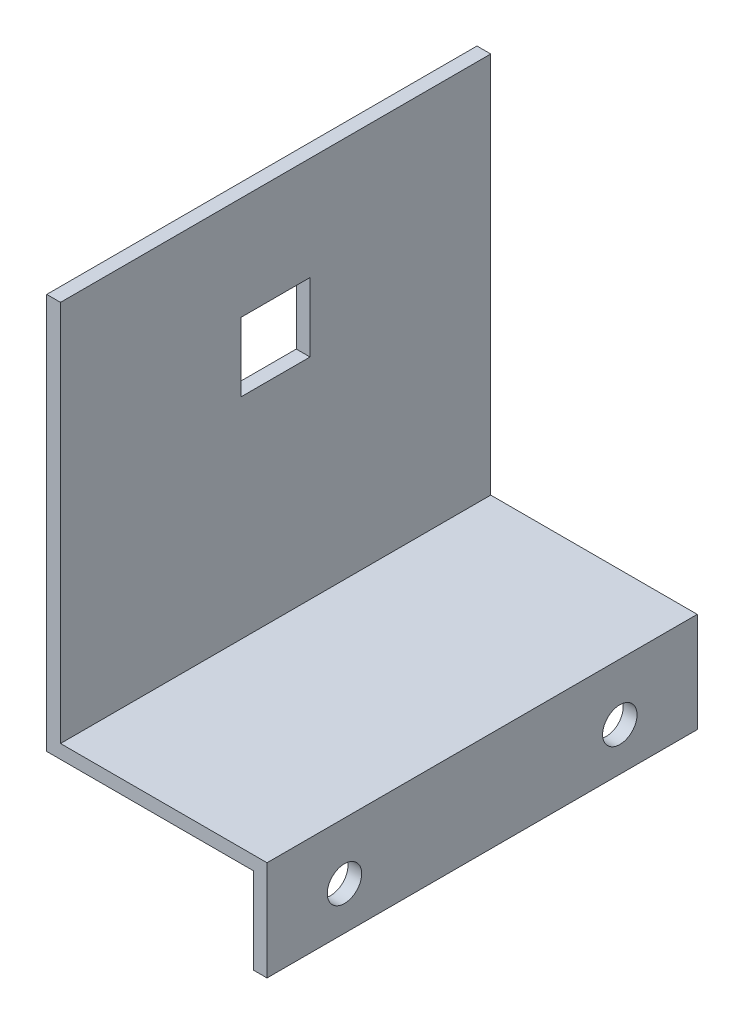
ISO-10303-21;
HEADER;
FILE_DESCRIPTION(('STEP AP214'),'2;1');
FILE_NAME('part.step','',(''),(''),'','','');
FILE_SCHEMA(('AUTOMOTIVE_DESIGN { 1 0 10303 214 1 1 1 1 }'));
ENDSEC;
DATA;
#1=APPLICATION_CONTEXT('core data for automotive mechanical design processes');
#2=APPLICATION_PROTOCOL_DEFINITION('international standard','automotive_design',2000,#1);
#3=PRODUCT_CONTEXT('',#1,'mechanical');
#4=PRODUCT('Part','Part','',(#3));
#5=PRODUCT_RELATED_PRODUCT_CATEGORY('part','',(#4));
#6=PRODUCT_DEFINITION_FORMATION('','',#4);
#7=PRODUCT_DEFINITION_CONTEXT('part definition',#1,'design');
#8=PRODUCT_DEFINITION('design','',#6,#7);
#9=PRODUCT_DEFINITION_SHAPE('','',#8);
#10=(LENGTH_UNIT() NAMED_UNIT(*) SI_UNIT(.MILLI.,.METRE.));
#11=(NAMED_UNIT(*) PLANE_ANGLE_UNIT() SI_UNIT($,.RADIAN.));
#12=(NAMED_UNIT(*) SI_UNIT($,.STERADIAN.) SOLID_ANGLE_UNIT());
#13=UNCERTAINTY_MEASURE_WITH_UNIT(LENGTH_MEASURE(1.E-05),#10,'distance_accuracy_value','');
#14=(GEOMETRIC_REPRESENTATION_CONTEXT(3) GLOBAL_UNCERTAINTY_ASSIGNED_CONTEXT((#13)) GLOBAL_UNIT_ASSIGNED_CONTEXT((#10,
#11,#12)) REPRESENTATION_CONTEXT('',''));
#15=CARTESIAN_POINT('',(0.,0.,0.));
#16=DIRECTION('',(0.,0.,1.));
#17=DIRECTION('',(1.,0.,0.));
#18=AXIS2_PLACEMENT_3D('',#15,#16,#17);
#19=CARTESIAN_POINT('',(0.,0.,-63.5));
#20=DIRECTION('',(-1.,0.,0.));
#21=DIRECTION('',(0.,0.,1.));
#22=AXIS2_PLACEMENT_3D('',#19,#20,#21);
#23=PLANE('',#22);
#24=DIRECTION('',(0.,1.,0.));
#25=VECTOR('',#24,1.);
#26=CARTESIAN_POINT('',(0.,43.18,-36.83));
#27=LINE('',#26,#25);
#28=CARTESIAN_POINT('',(0.,33.02,-36.83));
#29=VERTEX_POINT('',#28);
#30=CARTESIAN_POINT('',(0.,43.18,-36.83));
#31=VERTEX_POINT('',#30);
#32=EDGE_CURVE('E124',#29,#31,#27,.T.);
#33=ORIENTED_EDGE('',*,*,#32,.T.);
#34=DIRECTION('',(0.,0.,1.));
#35=VECTOR('',#34,1.);
#36=CARTESIAN_POINT('',(0.,43.18,-31.75));
#37=LINE('',#36,#35);
#38=CARTESIAN_POINT('',(0.,43.18,-26.67));
#39=VERTEX_POINT('',#38);
#40=EDGE_CURVE('E133',#31,#39,#37,.T.);
#41=ORIENTED_EDGE('',*,*,#40,.T.);
#42=DIRECTION('',(0.,-1.,0.));
#43=VECTOR('',#42,1.);
#44=CARTESIAN_POINT('',(0.,33.02,-26.67));
#45=LINE('',#44,#43);
#46=CARTESIAN_POINT('',(0.,33.02,-26.67));
#47=VERTEX_POINT('',#46);
#48=EDGE_CURVE('E49',#39,#47,#45,.T.);
#49=ORIENTED_EDGE('',*,*,#48,.T.);
#50=DIRECTION('',(0.,0.,-1.));
#51=VECTOR('',#50,1.);
#52=CARTESIAN_POINT('',(0.,33.02,-36.83));
#53=LINE('',#52,#51);
#54=EDGE_CURVE('E130',#47,#29,#53,.T.);
#55=ORIENTED_EDGE('',*,*,#54,.T.);
#56=EDGE_LOOP('',(#33,#41,#49,#55));
#57=FACE_BOUND('',#56,.T.);
#58=DIRECTION('',(0.,-1.,0.));
#59=VECTOR('',#58,1.);
#60=CARTESIAN_POINT('',(0.,0.,0.));
#61=LINE('',#60,#59);
#62=CARTESIAN_POINT('',(0.,58.42,0.));
#63=VERTEX_POINT('',#62);
#64=CARTESIAN_POINT('',(0.,0.,0.));
#65=VERTEX_POINT('',#64);
#66=EDGE_CURVE('E158',#63,#65,#61,.T.);
#67=ORIENTED_EDGE('',*,*,#66,.F.);
#68=DIRECTION('',(0.,0.,1.));
#69=VECTOR('',#68,1.);
#70=CARTESIAN_POINT('',(0.,58.42,-63.5));
#71=LINE('',#70,#69);
#72=CARTESIAN_POINT('',(0.,58.42,-63.5));
#73=VERTEX_POINT('',#72);
#74=EDGE_CURVE('E11',#73,#63,#71,.T.);
#75=ORIENTED_EDGE('',*,*,#74,.F.);
#76=DIRECTION('',(0.,-1.,0.));
#77=VECTOR('',#76,1.);
#78=CARTESIAN_POINT('',(0.,0.,-63.5));
#79=LINE('',#78,#77);
#80=CARTESIAN_POINT('',(0.,0.,-63.5));
#81=VERTEX_POINT('',#80);
#82=EDGE_CURVE('E162',#73,#81,#79,.T.);
#83=ORIENTED_EDGE('',*,*,#82,.T.);
#84=DIRECTION('',(0.,0.,1.));
#85=VECTOR('',#84,1.);
#86=CARTESIAN_POINT('',(0.,0.,-63.5));
#87=LINE('',#86,#85);
#88=EDGE_CURVE('E36',#81,#65,#87,.T.);
#89=ORIENTED_EDGE('',*,*,#88,.T.);
#90=EDGE_LOOP('',(#67,#75,#83,#89));
#91=FACE_BOUND('',#90,.T.);
#92=ADVANCED_FACE('F33',(#57,#91),#23,.T.);
#93=CARTESIAN_POINT('',(0.,58.42,-63.5));
#94=DIRECTION('',(0.,1.,0.));
#95=DIRECTION('',(0.,0.,1.));
#96=AXIS2_PLACEMENT_3D('',#93,#94,#95);
#97=PLANE('',#96);
#98=DIRECTION('',(-1.,0.,0.));
#99=VECTOR('',#98,1.);
#100=CARTESIAN_POINT('',(0.,58.42,0.));
#101=LINE('',#100,#99);
#102=CARTESIAN_POINT('',(2.03199999999999,58.42,0.));
#103=VERTEX_POINT('',#102);
#104=EDGE_CURVE('E166',#103,#63,#101,.T.);
#105=ORIENTED_EDGE('',*,*,#104,.F.);
#106=DIRECTION('',(0.,0.,1.));
#107=VECTOR('',#106,1.);
#108=CARTESIAN_POINT('',(2.03199999999999,58.42,-63.5));
#109=LINE('',#108,#107);
#110=CARTESIAN_POINT('',(2.03199999999999,58.42,-63.5));
#111=VERTEX_POINT('',#110);
#112=EDGE_CURVE('E41',#111,#103,#109,.T.);
#113=ORIENTED_EDGE('',*,*,#112,.F.);
#114=DIRECTION('',(-1.,0.,0.));
#115=VECTOR('',#114,1.);
#116=CARTESIAN_POINT('',(0.,58.42,-63.5));
#117=LINE('',#116,#115);
#118=EDGE_CURVE('E184',#111,#73,#117,.T.);
#119=ORIENTED_EDGE('',*,*,#118,.T.);
#120=ORIENTED_EDGE('',*,*,#74,.T.);
#121=EDGE_LOOP('',(#105,#113,#119,#120));
#122=FACE_BOUND('',#121,.T.);
#123=ADVANCED_FACE('F230',(#122),#97,.T.);
#124=CARTESIAN_POINT('',(2.03199999999999,58.42,-63.5));
#125=DIRECTION('',(1.,0.,0.));
#126=DIRECTION('',(0.,1.,0.));
#127=AXIS2_PLACEMENT_3D('',#124,#125,#126);
#128=PLANE('',#127);
#129=DIRECTION('',(0.,1.,0.));
#130=VECTOR('',#129,1.);
#131=CARTESIAN_POINT('',(2.032,43.18,-36.83));
#132=LINE('',#131,#130);
#133=CARTESIAN_POINT('',(2.032,33.02,-36.83));
#134=VERTEX_POINT('',#133);
#135=CARTESIAN_POINT('',(2.03199999999999,43.18,-36.83));
#136=VERTEX_POINT('',#135);
#137=EDGE_CURVE('E57',#134,#136,#132,.T.);
#138=ORIENTED_EDGE('',*,*,#137,.F.);
#139=DIRECTION('',(0.,0.,-1.));
#140=VECTOR('',#139,1.);
#141=CARTESIAN_POINT('',(2.032,33.02,-36.83));
#142=LINE('',#141,#140);
#143=CARTESIAN_POINT('',(2.032,33.02,-26.67));
#144=VERTEX_POINT('',#143);
#145=EDGE_CURVE('E139',#144,#134,#142,.T.);
#146=ORIENTED_EDGE('',*,*,#145,.F.);
#147=DIRECTION('',(0.,-1.,0.));
#148=VECTOR('',#147,1.);
#149=CARTESIAN_POINT('',(2.032,33.02,-26.67));
#150=LINE('',#149,#148);
#151=CARTESIAN_POINT('',(2.032,43.18,-26.67));
#152=VERTEX_POINT('',#151);
#153=EDGE_CURVE('E142',#152,#144,#150,.T.);
#154=ORIENTED_EDGE('',*,*,#153,.F.);
#155=DIRECTION('',(0.,0.,1.));
#156=VECTOR('',#155,1.);
#157=CARTESIAN_POINT('',(2.032,43.18,-26.67));
#158=LINE('',#157,#156);
#159=EDGE_CURVE('E151',#136,#152,#158,.T.);
#160=ORIENTED_EDGE('',*,*,#159,.F.);
#161=EDGE_LOOP('',(#138,#146,#154,#160));
#162=FACE_BOUND('',#161,.T.);
#163=DIRECTION('',(0.,1.,0.));
#164=VECTOR('',#163,1.);
#165=CARTESIAN_POINT('',(2.03199999999999,58.42,0.));
#166=LINE('',#165,#164);
#167=CARTESIAN_POINT('',(2.032,2.032,0.));
#168=VERTEX_POINT('',#167);
#169=EDGE_CURVE('E204',#168,#103,#166,.T.);
#170=ORIENTED_EDGE('',*,*,#169,.F.);
#171=DIRECTION('',(0.,0.,1.));
#172=VECTOR('',#171,1.);
#173=CARTESIAN_POINT('',(2.032,2.032,-63.5));
#174=LINE('',#173,#172);
#175=CARTESIAN_POINT('',(2.032,2.032,-63.5));
#176=VERTEX_POINT('',#175);
#177=EDGE_CURVE('E210',#176,#168,#174,.T.);
#178=ORIENTED_EDGE('',*,*,#177,.F.);
#179=DIRECTION('',(0.,1.,0.));
#180=VECTOR('',#179,1.);
#181=CARTESIAN_POINT('',(2.03199999999999,58.42,-63.5));
#182=LINE('',#181,#180);
#183=EDGE_CURVE('E181',#176,#111,#182,.T.);
#184=ORIENTED_EDGE('',*,*,#183,.T.);
#185=ORIENTED_EDGE('',*,*,#112,.T.);
#186=EDGE_LOOP('',(#170,#178,#184,#185));
#187=FACE_BOUND('',#186,.T.);
#188=ADVANCED_FACE('F251',(#162,#187),#128,.T.);
#189=CARTESIAN_POINT('',(2.032,2.032,-63.5));
#190=DIRECTION('',(0.,1.,0.));
#191=DIRECTION('',(0.,0.,1.));
#192=AXIS2_PLACEMENT_3D('',#189,#190,#191);
#193=PLANE('',#192);
#194=DIRECTION('',(-1.,0.,0.));
#195=VECTOR('',#194,1.);
#196=CARTESIAN_POINT('',(2.032,2.032,0.));
#197=LINE('',#196,#195);
#198=CARTESIAN_POINT('',(32.512,2.032,0.));
#199=VERTEX_POINT('',#198);
#200=EDGE_CURVE('E201',#199,#168,#197,.T.);
#201=ORIENTED_EDGE('',*,*,#200,.F.);
#202=DIRECTION('',(0.,0.,1.));
#203=VECTOR('',#202,1.);
#204=CARTESIAN_POINT('',(32.512,2.032,-63.5));
#205=LINE('',#204,#203);
#206=CARTESIAN_POINT('',(32.512,2.032,-63.5));
#207=VERTEX_POINT('',#206);
#208=EDGE_CURVE('E212',#207,#199,#205,.T.);
#209=ORIENTED_EDGE('',*,*,#208,.F.);
#210=DIRECTION('',(-1.,0.,0.));
#211=VECTOR('',#210,1.);
#212=CARTESIAN_POINT('',(2.032,2.032,-63.5));
#213=LINE('',#212,#211);
#214=EDGE_CURVE('E178',#207,#176,#213,.T.);
#215=ORIENTED_EDGE('',*,*,#214,.T.);
#216=ORIENTED_EDGE('',*,*,#177,.T.);
#217=EDGE_LOOP('',(#201,#209,#215,#216));
#218=FACE_BOUND('',#217,.T.);
#219=ADVANCED_FACE('F249',(#218),#193,.T.);
#220=CARTESIAN_POINT('',(32.512,2.032,-63.5));
#221=DIRECTION('',(1.,0.,0.));
#222=DIRECTION('',(0.,0.,-1.));
#223=AXIS2_PLACEMENT_3D('',#220,#221,#222);
#224=PLANE('',#223);
#225=CARTESIAN_POINT('',(32.512,-6.35,-11.43));
#226=DIRECTION('',(-1.,0.,0.));
#227=DIRECTION('',(0.,0.,-1.));
#228=AXIS2_PLACEMENT_3D('',#225,#226,#227);
#229=CIRCLE('',#228,2.54);
#230=CARTESIAN_POINT('',(32.512,-6.35,-13.97));
#231=VERTEX_POINT('',#230);
#232=EDGE_CURVE('E377',#231,#231,#229,.T.);
#233=ORIENTED_EDGE('',*,*,#232,.T.);
#234=EDGE_LOOP('',(#233));
#235=FACE_BOUND('',#234,.T.);
#236=CARTESIAN_POINT('',(32.512,-6.35,-52.07));
#237=DIRECTION('',(-1.,0.,0.));
#238=DIRECTION('',(0.,0.,1.));
#239=AXIS2_PLACEMENT_3D('',#236,#237,#238);
#240=CIRCLE('',#239,2.54);
#241=CARTESIAN_POINT('',(32.512,-6.35,-49.53));
#242=VERTEX_POINT('',#241);
#243=EDGE_CURVE('E152',#242,#242,#240,.T.);
#244=ORIENTED_EDGE('',*,*,#243,.T.);
#245=EDGE_LOOP('',(#244));
#246=FACE_BOUND('',#245,.T.);
#247=DIRECTION('',(0.,1.,0.));
#248=VECTOR('',#247,1.);
#249=CARTESIAN_POINT('',(32.512,2.032,0.));
#250=LINE('',#249,#248);
#251=CARTESIAN_POINT('',(32.512,-12.7,0.));
#252=VERTEX_POINT('',#251);
#253=EDGE_CURVE('E198',#252,#199,#250,.T.);
#254=ORIENTED_EDGE('',*,*,#253,.F.);
#255=DIRECTION('',(0.,0.,1.));
#256=VECTOR('',#255,1.);
#257=CARTESIAN_POINT('',(32.512,-12.7,-63.5));
#258=LINE('',#257,#256);
#259=CARTESIAN_POINT('',(32.512,-12.7,-63.5));
#260=VERTEX_POINT('',#259);
#261=EDGE_CURVE('E214',#260,#252,#258,.T.);
#262=ORIENTED_EDGE('',*,*,#261,.F.);
#263=DIRECTION('',(0.,1.,0.));
#264=VECTOR('',#263,1.);
#265=CARTESIAN_POINT('',(32.512,2.032,-63.5));
#266=LINE('',#265,#264);
#267=EDGE_CURVE('E175',#260,#207,#266,.T.);
#268=ORIENTED_EDGE('',*,*,#267,.T.);
#269=ORIENTED_EDGE('',*,*,#208,.T.);
#270=EDGE_LOOP('',(#254,#262,#268,#269));
#271=FACE_BOUND('',#270,.T.);
#272=ADVANCED_FACE('F245',(#235,#246,#271),#224,.T.);
#273=CARTESIAN_POINT('',(32.512,-12.7,-63.5));
#274=DIRECTION('',(0.,-1.,0.));
#275=DIRECTION('',(0.,0.,-1.));
#276=AXIS2_PLACEMENT_3D('',#273,#274,#275);
#277=PLANE('',#276);
#278=DIRECTION('',(1.,0.,0.));
#279=VECTOR('',#278,1.);
#280=CARTESIAN_POINT('',(32.512,-12.7,0.));
#281=LINE('',#280,#279);
#282=CARTESIAN_POINT('',(30.48,-12.7,0.));
#283=VERTEX_POINT('',#282);
#284=EDGE_CURVE('E195',#283,#252,#281,.T.);
#285=ORIENTED_EDGE('',*,*,#284,.F.);
#286=DIRECTION('',(0.,0.,1.));
#287=VECTOR('',#286,1.);
#288=CARTESIAN_POINT('',(30.48,-12.7,-63.5));
#289=LINE('',#288,#287);
#290=CARTESIAN_POINT('',(30.48,-12.7,-63.5));
#291=VERTEX_POINT('',#290);
#292=EDGE_CURVE('E216',#291,#283,#289,.T.);
#293=ORIENTED_EDGE('',*,*,#292,.F.);
#294=DIRECTION('',(1.,0.,0.));
#295=VECTOR('',#294,1.);
#296=CARTESIAN_POINT('',(32.512,-12.7,-63.5));
#297=LINE('',#296,#295);
#298=EDGE_CURVE('E172',#291,#260,#297,.T.);
#299=ORIENTED_EDGE('',*,*,#298,.T.);
#300=ORIENTED_EDGE('',*,*,#261,.T.);
#301=EDGE_LOOP('',(#285,#293,#299,#300));
#302=FACE_BOUND('',#301,.T.);
#303=ADVANCED_FACE('F243',(#302),#277,.T.);
#304=CARTESIAN_POINT('',(30.48,0.,-63.5));
#305=DIRECTION('',(-1.,0.,0.));
#306=DIRECTION('',(0.,0.,1.));
#307=AXIS2_PLACEMENT_3D('',#304,#305,#306);
#308=PLANE('',#307);
#309=CARTESIAN_POINT('',(30.48,-6.35,-11.43));
#310=DIRECTION('',(-1.,0.,0.));
#311=DIRECTION('',(0.,0.,-1.));
#312=AXIS2_PLACEMENT_3D('',#309,#310,#311);
#313=CIRCLE('',#312,2.54);
#314=CARTESIAN_POINT('',(30.48,-6.35,-13.97));
#315=VERTEX_POINT('',#314);
#316=EDGE_CURVE('E380',#315,#315,#313,.T.);
#317=ORIENTED_EDGE('',*,*,#316,.F.);
#318=EDGE_LOOP('',(#317));
#319=FACE_BOUND('',#318,.T.);
#320=CARTESIAN_POINT('',(30.48,-6.35,-52.07));
#321=DIRECTION('',(-1.,0.,0.));
#322=DIRECTION('',(0.,0.,1.));
#323=AXIS2_PLACEMENT_3D('',#320,#321,#322);
#324=CIRCLE('',#323,2.54);
#325=CARTESIAN_POINT('',(30.48,-6.35,-49.53));
#326=VERTEX_POINT('',#325);
#327=EDGE_CURVE('E145',#326,#326,#324,.T.);
#328=ORIENTED_EDGE('',*,*,#327,.F.);
#329=EDGE_LOOP('',(#328));
#330=FACE_BOUND('',#329,.T.);
#331=DIRECTION('',(0.,-1.,0.));
#332=VECTOR('',#331,1.);
#333=CARTESIAN_POINT('',(30.48,0.,0.));
#334=LINE('',#333,#332);
#335=CARTESIAN_POINT('',(30.48,0.,0.));
#336=VERTEX_POINT('',#335);
#337=EDGE_CURVE('E192',#336,#283,#334,.T.);
#338=ORIENTED_EDGE('',*,*,#337,.F.);
#339=DIRECTION('',(0.,0.,1.));
#340=VECTOR('',#339,1.);
#341=CARTESIAN_POINT('',(30.48,0.,-63.5));
#342=LINE('',#341,#340);
#343=CARTESIAN_POINT('',(30.48,0.,-63.5));
#344=VERTEX_POINT('',#343);
#345=EDGE_CURVE('E217',#344,#336,#342,.T.);
#346=ORIENTED_EDGE('',*,*,#345,.F.);
#347=DIRECTION('',(0.,-1.,0.));
#348=VECTOR('',#347,1.);
#349=CARTESIAN_POINT('',(30.48,0.,-63.5));
#350=LINE('',#349,#348);
#351=EDGE_CURVE('E169',#344,#291,#350,.T.);
#352=ORIENTED_EDGE('',*,*,#351,.T.);
#353=ORIENTED_EDGE('',*,*,#292,.T.);
#354=EDGE_LOOP('',(#338,#346,#352,#353));
#355=FACE_BOUND('',#354,.T.);
#356=ADVANCED_FACE('F239',(#319,#330,#355),#308,.T.);
#357=CARTESIAN_POINT('',(0.,0.,-63.5));
#358=DIRECTION('',(0.,-1.,0.));
#359=DIRECTION('',(0.,0.,-1.));
#360=AXIS2_PLACEMENT_3D('',#357,#358,#359);
#361=PLANE('',#360);
#362=DIRECTION('',(1.,0.,0.));
#363=VECTOR('',#362,1.);
#364=CARTESIAN_POINT('',(0.,0.,0.));
#365=LINE('',#364,#363);
#366=EDGE_CURVE('E189',#65,#336,#365,.T.);
#367=ORIENTED_EDGE('',*,*,#366,.F.);
#368=ORIENTED_EDGE('',*,*,#88,.F.);
#369=DIRECTION('',(1.,0.,0.));
#370=VECTOR('',#369,1.);
#371=CARTESIAN_POINT('',(0.,0.,-63.5));
#372=LINE('',#371,#370);
#373=EDGE_CURVE('E165',#81,#344,#372,.T.);
#374=ORIENTED_EDGE('',*,*,#373,.T.);
#375=ORIENTED_EDGE('',*,*,#345,.T.);
#376=EDGE_LOOP('',(#367,#368,#374,#375));
#377=FACE_BOUND('',#376,.T.);
#378=ADVANCED_FACE('F224',(#377),#361,.T.);
#379=CARTESIAN_POINT('',(0.,0.,-63.5));
#380=DIRECTION('',(0.,0.,-1.));
#381=DIRECTION('',(-1.,0.,0.));
#382=AXIS2_PLACEMENT_3D('',#379,#380,#381);
#383=PLANE('',#382);
#384=ORIENTED_EDGE('',*,*,#82,.F.);
#385=ORIENTED_EDGE('',*,*,#118,.F.);
#386=ORIENTED_EDGE('',*,*,#183,.F.);
#387=ORIENTED_EDGE('',*,*,#214,.F.);
#388=ORIENTED_EDGE('',*,*,#267,.F.);
#389=ORIENTED_EDGE('',*,*,#298,.F.);
#390=ORIENTED_EDGE('',*,*,#351,.F.);
#391=ORIENTED_EDGE('',*,*,#373,.F.);
#392=EDGE_LOOP('',(#384,#385,#386,#387,#388,#389,#390,#391));
#393=FACE_BOUND('',#392,.T.);
#394=ADVANCED_FACE('F233',(#393),#383,.T.);
#395=CARTESIAN_POINT('',(0.,0.,0.));
#396=DIRECTION('',(0.,0.,-1.));
#397=DIRECTION('',(-1.,0.,0.));
#398=AXIS2_PLACEMENT_3D('',#395,#396,#397);
#399=PLANE('',#398);
#400=ORIENTED_EDGE('',*,*,#66,.T.);
#401=ORIENTED_EDGE('',*,*,#366,.T.);
#402=ORIENTED_EDGE('',*,*,#337,.T.);
#403=ORIENTED_EDGE('',*,*,#284,.T.);
#404=ORIENTED_EDGE('',*,*,#253,.T.);
#405=ORIENTED_EDGE('',*,*,#200,.T.);
#406=ORIENTED_EDGE('',*,*,#169,.T.);
#407=ORIENTED_EDGE('',*,*,#104,.T.);
#408=EDGE_LOOP('',(#400,#401,#402,#403,#404,#405,#406,#407));
#409=FACE_BOUND('',#408,.T.);
#410=ADVANCED_FACE('F226',(#409),#399,.F.);
#411=CARTESIAN_POINT('',(0.,43.18,-36.83));
#412=DIRECTION('',(0.,0.,-1.));
#413=DIRECTION('',(-1.,0.,0.));
#414=AXIS2_PLACEMENT_3D('',#411,#412,#413);
#415=PLANE('',#414);
#416=ORIENTED_EDGE('',*,*,#137,.T.);
#417=DIRECTION('',(1.,0.,0.));
#418=VECTOR('',#417,1.);
#419=CARTESIAN_POINT('',(0.,43.18,-36.83));
#420=LINE('',#419,#418);
#421=EDGE_CURVE('E120',#31,#136,#420,.T.);
#422=ORIENTED_EDGE('',*,*,#421,.F.);
#423=ORIENTED_EDGE('',*,*,#32,.F.);
#424=DIRECTION('',(1.,0.,0.));
#425=VECTOR('',#424,1.);
#426=CARTESIAN_POINT('',(0.,33.02,-36.83));
#427=LINE('',#426,#425);
#428=EDGE_CURVE('E156',#29,#134,#427,.T.);
#429=ORIENTED_EDGE('',*,*,#428,.T.);
#430=EDGE_LOOP('',(#416,#422,#423,#429));
#431=FACE_BOUND('',#430,.T.);
#432=ADVANCED_FACE('F122',(#431),#415,.F.);
#433=CARTESIAN_POINT('',(0.,33.02,-36.83));
#434=DIRECTION('',(0.,-1.,0.));
#435=DIRECTION('',(1.,0.,0.));
#436=AXIS2_PLACEMENT_3D('',#433,#434,#435);
#437=PLANE('',#436);
#438=ORIENTED_EDGE('',*,*,#145,.T.);
#439=ORIENTED_EDGE('',*,*,#428,.F.);
#440=ORIENTED_EDGE('',*,*,#54,.F.);
#441=DIRECTION('',(1.,0.,0.));
#442=VECTOR('',#441,1.);
#443=CARTESIAN_POINT('',(0.,33.02,-26.67));
#444=LINE('',#443,#442);
#445=EDGE_CURVE('E159',#47,#144,#444,.T.);
#446=ORIENTED_EDGE('',*,*,#445,.T.);
#447=EDGE_LOOP('',(#438,#439,#440,#446));
#448=FACE_BOUND('',#447,.T.);
#449=ADVANCED_FACE('F319',(#448),#437,.F.);
#450=CARTESIAN_POINT('',(0.,33.02,-26.67));
#451=DIRECTION('',(0.,0.,1.));
#452=DIRECTION('',(1.,0.,0.));
#453=AXIS2_PLACEMENT_3D('',#450,#451,#452);
#454=PLANE('',#453);
#455=ORIENTED_EDGE('',*,*,#153,.T.);
#456=ORIENTED_EDGE('',*,*,#445,.F.);
#457=ORIENTED_EDGE('',*,*,#48,.F.);
#458=DIRECTION('',(1.,0.,0.));
#459=VECTOR('',#458,1.);
#460=CARTESIAN_POINT('',(0.,43.18,-26.67));
#461=LINE('',#460,#459);
#462=EDGE_CURVE('E129',#39,#152,#461,.T.);
#463=ORIENTED_EDGE('',*,*,#462,.T.);
#464=EDGE_LOOP('',(#455,#456,#457,#463));
#465=FACE_BOUND('',#464,.T.);
#466=ADVANCED_FACE('F325',(#465),#454,.F.);
#467=CARTESIAN_POINT('',(0.,43.18,-26.67));
#468=DIRECTION('',(0.,1.,0.));
#469=DIRECTION('',(-1.,0.,0.));
#470=AXIS2_PLACEMENT_3D('',#467,#468,#469);
#471=PLANE('',#470);
#472=ORIENTED_EDGE('',*,*,#159,.T.);
#473=ORIENTED_EDGE('',*,*,#462,.F.);
#474=ORIENTED_EDGE('',*,*,#40,.F.);
#475=ORIENTED_EDGE('',*,*,#421,.T.);
#476=EDGE_LOOP('',(#472,#473,#474,#475));
#477=FACE_BOUND('',#476,.T.);
#478=ADVANCED_FACE('F134',(#477),#471,.F.);
#479=CARTESIAN_POINT('',(32.512,-6.35,-52.07));
#480=DIRECTION('',(-1.,0.,0.));
#481=DIRECTION('',(0.,0.,1.));
#482=AXIS2_PLACEMENT_3D('',#479,#480,#481);
#483=CYLINDRICAL_SURFACE('',#482,2.54);
#484=ORIENTED_EDGE('',*,*,#243,.F.);
#485=EDGE_LOOP('',(#484));
#486=FACE_BOUND('',#485,.T.);
#487=ORIENTED_EDGE('',*,*,#327,.T.);
#488=EDGE_LOOP('',(#487));
#489=FACE_BOUND('',#488,.T.);
#490=ADVANCED_FACE('F339',(#486,#489),#483,.F.);
#491=CARTESIAN_POINT('',(32.512,-6.35,-11.43));
#492=DIRECTION('',(-1.,0.,0.));
#493=DIRECTION('',(0.,0.,1.));
#494=AXIS2_PLACEMENT_3D('',#491,#492,#493);
#495=CYLINDRICAL_SURFACE('',#494,2.54);
#496=ORIENTED_EDGE('',*,*,#232,.F.);
#497=EDGE_LOOP('',(#496));
#498=FACE_BOUND('',#497,.T.);
#499=ORIENTED_EDGE('',*,*,#316,.T.);
#500=EDGE_LOOP('',(#499));
#501=FACE_BOUND('',#500,.T.);
#502=ADVANCED_FACE('F347',(#498,#501),#495,.F.);
#503=CLOSED_SHELL('',(#92,#123,#188,#219,#272,#303,#356,#378,#394,#410,#432,#449,#466,#478,#490,#502));
#504=MANIFOLD_SOLID_BREP('B2',#503);
#505=ADVANCED_BREP_SHAPE_REPRESENTATION('',(#18,#504),#14);
#506=SHAPE_DEFINITION_REPRESENTATION(#9,#505);
ENDSEC;
END-ISO-10303-21;
